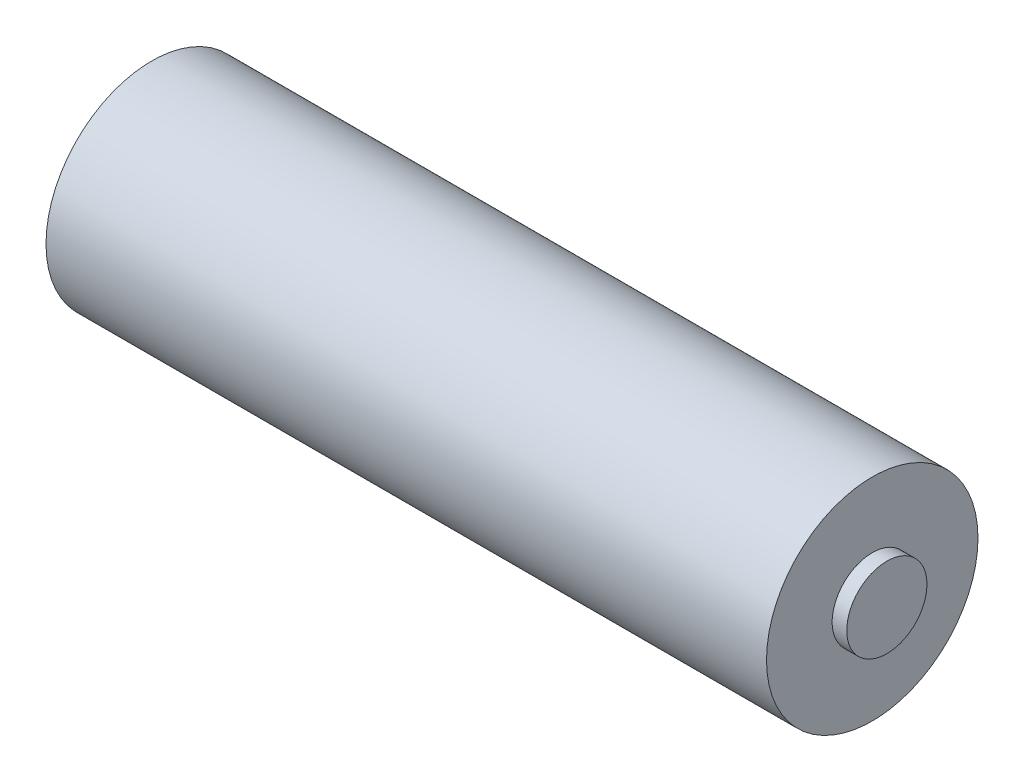
ISO-10303-21;
HEADER;
FILE_DESCRIPTION(('STEP AP214'),'2;1');
FILE_NAME('part.step','',(''),(''),'','','');
FILE_SCHEMA(('AUTOMOTIVE_DESIGN { 1 0 10303 214 1 1 1 1 }'));
ENDSEC;
DATA;
#1=APPLICATION_CONTEXT('core data for automotive mechanical design processes');
#2=APPLICATION_PROTOCOL_DEFINITION('international standard','automotive_design',2000,#1);
#3=PRODUCT_CONTEXT('',#1,'mechanical');
#4=PRODUCT('Part','Part','',(#3));
#5=PRODUCT_RELATED_PRODUCT_CATEGORY('part','',(#4));
#6=PRODUCT_DEFINITION_FORMATION('','',#4);
#7=PRODUCT_DEFINITION_CONTEXT('part definition',#1,'design');
#8=PRODUCT_DEFINITION('design','',#6,#7);
#9=PRODUCT_DEFINITION_SHAPE('','',#8);
#10=(LENGTH_UNIT() NAMED_UNIT(*) SI_UNIT(.MILLI.,.METRE.));
#11=(NAMED_UNIT(*) PLANE_ANGLE_UNIT() SI_UNIT($,.RADIAN.));
#12=(NAMED_UNIT(*) SI_UNIT($,.STERADIAN.) SOLID_ANGLE_UNIT());
#13=UNCERTAINTY_MEASURE_WITH_UNIT(LENGTH_MEASURE(1.E-05),#10,'distance_accuracy_value','');
#14=(GEOMETRIC_REPRESENTATION_CONTEXT(3) GLOBAL_UNCERTAINTY_ASSIGNED_CONTEXT((#13)) GLOBAL_UNIT_ASSIGNED_CONTEXT((#10,
#11,#12)) REPRESENTATION_CONTEXT('',''));
#15=CARTESIAN_POINT('',(0.,0.,0.));
#16=DIRECTION('',(0.,0.,1.));
#17=DIRECTION('',(1.,0.,0.));
#18=AXIS2_PLACEMENT_3D('',#15,#16,#17);
#19=CARTESIAN_POINT('',(0.,0.,0.));
#20=DIRECTION('',(1.,0.,0.));
#21=DIRECTION('',(0.,0.,-1.));
#22=AXIS2_PLACEMENT_3D('',#19,#20,#21);
#23=PLANE('',#22);
#24=CARTESIAN_POINT('',(0.,0.,0.));
#25=DIRECTION('',(1.,0.,0.));
#26=DIRECTION('',(0.,0.,-1.));
#27=AXIS2_PLACEMENT_3D('',#24,#25,#26);
#28=CIRCLE('',#27,3.67320508075689);
#29=CARTESIAN_POINT('',(0.,0.,-3.67320508075689));
#30=VERTEX_POINT('',#29);
#31=EDGE_CURVE('E10',#30,#30,#28,.T.);
#32=ORIENTED_EDGE('',*,*,#31,.T.);
#33=EDGE_LOOP('',(#32));
#34=FACE_BOUND('',#33,.T.);
#35=CARTESIAN_POINT('',(0.,0.,0.));
#36=DIRECTION('',(1.,0.,0.));
#37=DIRECTION('',(0.,0.,-1.));
#38=AXIS2_PLACEMENT_3D('',#35,#36,#37);
#39=CIRCLE('',#38,7.25);
#40=CARTESIAN_POINT('',(0.,0.,-7.25));
#41=VERTEX_POINT('',#40);
#42=EDGE_CURVE('E39',#41,#41,#39,.T.);
#43=ORIENTED_EDGE('',*,*,#42,.F.);
#44=EDGE_LOOP('',(#43));
#45=FACE_BOUND('',#44,.T.);
#46=ADVANCED_FACE('F28',(#34,#45),#23,.F.);
#47=CARTESIAN_POINT('',(49.4,0.,0.));
#48=DIRECTION('',(1.,0.,0.));
#49=DIRECTION('',(0.,0.,-1.));
#50=AXIS2_PLACEMENT_3D('',#47,#48,#49);
#51=PLANE('',#50);
#52=CARTESIAN_POINT('',(49.4,0.,0.));
#53=DIRECTION('',(1.,0.,0.));
#54=DIRECTION('',(0.,0.,-1.));
#55=AXIS2_PLACEMENT_3D('',#52,#53,#54);
#56=CIRCLE('',#55,7.25);
#57=CARTESIAN_POINT('',(49.4,0.,-7.25));
#58=VERTEX_POINT('',#57);
#59=EDGE_CURVE('E35',#58,#58,#56,.T.);
#60=ORIENTED_EDGE('',*,*,#59,.T.);
#61=EDGE_LOOP('',(#60));
#62=FACE_BOUND('',#61,.T.);
#63=CARTESIAN_POINT('',(49.4,0.,0.));
#64=DIRECTION('',(1.,0.,0.));
#65=DIRECTION('',(0.,0.,-1.));
#66=AXIS2_PLACEMENT_3D('',#63,#64,#65);
#67=CIRCLE('',#66,2.75);
#68=CARTESIAN_POINT('',(49.4,0.,-2.75));
#69=VERTEX_POINT('',#68);
#70=EDGE_CURVE('E46',#69,#69,#67,.T.);
#71=ORIENTED_EDGE('',*,*,#70,.F.);
#72=EDGE_LOOP('',(#71));
#73=FACE_BOUND('',#72,.T.);
#74=ADVANCED_FACE('F65',(#62,#73),#51,.T.);
#75=CARTESIAN_POINT('',(49.4,0.,0.));
#76=DIRECTION('',(-1.,0.,0.));
#77=DIRECTION('',(0.,0.,1.));
#78=AXIS2_PLACEMENT_3D('',#75,#76,#77);
#79=CYLINDRICAL_SURFACE('',#78,7.25);
#80=ORIENTED_EDGE('',*,*,#59,.F.);
#81=EDGE_LOOP('',(#80));
#82=FACE_BOUND('',#81,.T.);
#83=ORIENTED_EDGE('',*,*,#42,.T.);
#84=EDGE_LOOP('',(#83));
#85=FACE_BOUND('',#84,.T.);
#86=ADVANCED_FACE('F70',(#82,#85),#79,.T.);
#87=CARTESIAN_POINT('',(50.4,0.,0.));
#88=DIRECTION('',(-1.,0.,0.));
#89=DIRECTION('',(0.,0.,1.));
#90=AXIS2_PLACEMENT_3D('',#87,#88,#89);
#91=CYLINDRICAL_SURFACE('',#90,2.75);
#92=CARTESIAN_POINT('',(50.4,0.,0.));
#93=DIRECTION('',(1.,0.,0.));
#94=DIRECTION('',(0.,0.,-1.));
#95=AXIS2_PLACEMENT_3D('',#92,#93,#94);
#96=CIRCLE('',#95,2.75);
#97=CARTESIAN_POINT('',(50.4,0.,-2.75));
#98=VERTEX_POINT('',#97);
#99=EDGE_CURVE('E44',#98,#98,#96,.T.);
#100=ORIENTED_EDGE('',*,*,#99,.F.);
#101=EDGE_LOOP('',(#100));
#102=FACE_BOUND('',#101,.T.);
#103=ORIENTED_EDGE('',*,*,#70,.T.);
#104=EDGE_LOOP('',(#103));
#105=FACE_BOUND('',#104,.T.);
#106=ADVANCED_FACE('F75',(#102,#105),#91,.T.);
#107=CARTESIAN_POINT('',(50.4,0.,0.));
#108=DIRECTION('',(1.,0.,0.));
#109=DIRECTION('',(0.,0.,-1.));
#110=AXIS2_PLACEMENT_3D('',#107,#108,#109);
#111=PLANE('',#110);
#112=ORIENTED_EDGE('',*,*,#99,.T.);
#113=EDGE_LOOP('',(#112));
#114=FACE_BOUND('',#113,.T.);
#115=ADVANCED_FACE('F62',(#114),#111,.T.);
#116=CARTESIAN_POINT('',(-0.1,0.,0.));
#117=DIRECTION('',(-1.,0.,0.));
#118=DIRECTION('',(0.,0.,1.));
#119=AXIS2_PLACEMENT_3D('',#116,#117,#118);
#120=PLANE('',#119);
#121=CARTESIAN_POINT('',(-0.1,0.,0.));
#122=DIRECTION('',(-1.,0.,0.));
#123=DIRECTION('',(0.,0.,1.));
#124=AXIS2_PLACEMENT_3D('',#121,#122,#123);
#125=CIRCLE('',#124,3.5);
#126=CARTESIAN_POINT('',(-0.1,0.,3.5));
#127=VERTEX_POINT('',#126);
#128=EDGE_CURVE('E49',#127,#127,#125,.T.);
#129=ORIENTED_EDGE('',*,*,#128,.T.);
#130=EDGE_LOOP('',(#129));
#131=FACE_BOUND('',#130,.T.);
#132=ADVANCED_FACE('F55',(#131),#120,.T.);
#133=CARTESIAN_POINT('',(-0.2,0.,0.));
#134=DIRECTION('',(1.,0.,0.));
#135=DIRECTION('',(0.,0.,-1.));
#136=AXIS2_PLACEMENT_3D('',#133,#134,#135);
#137=TOROIDAL_SURFACE('',#136,3.67320508075689,0.2);
#138=ORIENTED_EDGE('',*,*,#31,.F.);
#139=EDGE_LOOP('',(#138));
#140=FACE_BOUND('',#139,.T.);
#141=ORIENTED_EDGE('',*,*,#128,.F.);
#142=EDGE_LOOP('',(#141));
#143=FACE_BOUND('',#142,.T.);
#144=ADVANCED_FACE('F30',(#140,#143),#137,.F.);
#145=CLOSED_SHELL('',(#46,#74,#86,#106,#115,#132,#144));
#146=MANIFOLD_SOLID_BREP('B2',#145);
#147=ADVANCED_BREP_SHAPE_REPRESENTATION('',(#18,#146),#14);
#148=SHAPE_DEFINITION_REPRESENTATION(#9,#147);
ENDSEC;
END-ISO-10303-21;
